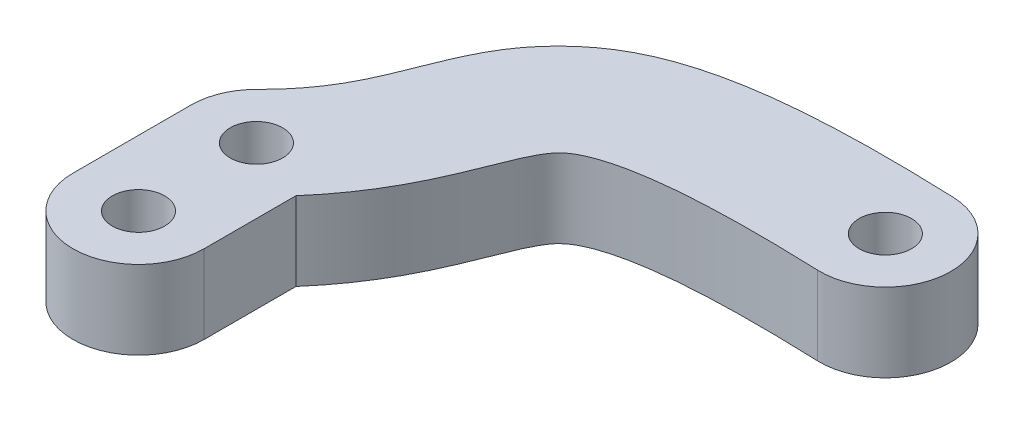
ISO-10303-21;
HEADER;
FILE_DESCRIPTION(('STEP AP214'),'2;1');
FILE_NAME('part.step','',(''),(''),'','','');
FILE_SCHEMA(('AUTOMOTIVE_DESIGN { 1 0 10303 214 1 1 1 1 }'));
ENDSEC;
DATA;
#1=APPLICATION_CONTEXT('core data for automotive mechanical design processes');
#2=APPLICATION_PROTOCOL_DEFINITION('international standard','automotive_design',2000,#1);
#3=PRODUCT_CONTEXT('',#1,'mechanical');
#4=PRODUCT('Part','Part','',(#3));
#5=PRODUCT_RELATED_PRODUCT_CATEGORY('part','',(#4));
#6=PRODUCT_DEFINITION_FORMATION('','',#4);
#7=PRODUCT_DEFINITION_CONTEXT('part definition',#1,'design');
#8=PRODUCT_DEFINITION('design','',#6,#7);
#9=PRODUCT_DEFINITION_SHAPE('','',#8);
#10=(LENGTH_UNIT() NAMED_UNIT(*) SI_UNIT(.MILLI.,.METRE.));
#11=(NAMED_UNIT(*) PLANE_ANGLE_UNIT() SI_UNIT($,.RADIAN.));
#12=(NAMED_UNIT(*) SI_UNIT($,.STERADIAN.) SOLID_ANGLE_UNIT());
#13=UNCERTAINTY_MEASURE_WITH_UNIT(LENGTH_MEASURE(1.E-05),#10,'distance_accuracy_value','');
#14=(GEOMETRIC_REPRESENTATION_CONTEXT(3) GLOBAL_UNCERTAINTY_ASSIGNED_CONTEXT((#13)) GLOBAL_UNIT_ASSIGNED_CONTEXT((#10,
#11,#12)) REPRESENTATION_CONTEXT('',''));
#15=CARTESIAN_POINT('',(0.,0.,0.));
#16=DIRECTION('',(0.,0.,1.));
#17=DIRECTION('',(1.,0.,0.));
#18=AXIS2_PLACEMENT_3D('',#15,#16,#17);
#19=CARTESIAN_POINT('',(2.49999999999998,3.,0.));
#20=DIRECTION('',(1.,0.,0.));
#21=DIRECTION('',(0.,0.,-1.));
#22=AXIS2_PLACEMENT_3D('',#19,#20,#21);
#23=PLANE('',#22);
#24=DIRECTION('',(0.,0.,1.));
#25=VECTOR('',#24,1.);
#26=CARTESIAN_POINT('',(2.49999999999998,0.,0.));
#27=LINE('',#26,#25);
#28=CARTESIAN_POINT('',(2.49999999999998,0.,0.990564635199866));
#29=VERTEX_POINT('',#28);
#30=CARTESIAN_POINT('',(2.49999999999998,0.,4.50000000001092));
#31=VERTEX_POINT('',#30);
#32=EDGE_CURVE('E126',#29,#31,#27,.T.);
#33=ORIENTED_EDGE('',*,*,#32,.F.);
#34=DIRECTION('',(0.,-1.,0.));
#35=VECTOR('',#34,1.);
#36=CARTESIAN_POINT('',(2.49999999999998,3.,0.990564635199866));
#37=LINE('',#36,#35);
#38=CARTESIAN_POINT('',(2.49999999999998,3.,0.990564635199866));
#39=VERTEX_POINT('',#38);
#40=EDGE_CURVE('E11',#39,#29,#37,.T.);
#41=ORIENTED_EDGE('',*,*,#40,.F.);
#42=DIRECTION('',(0.,0.,1.));
#43=VECTOR('',#42,1.);
#44=CARTESIAN_POINT('',(2.49999999999998,3.,0.));
#45=LINE('',#44,#43);
#46=CARTESIAN_POINT('',(2.49999999999998,3.,4.50000000001092));
#47=VERTEX_POINT('',#46);
#48=EDGE_CURVE('E152',#39,#47,#45,.T.);
#49=ORIENTED_EDGE('',*,*,#48,.T.);
#50=DIRECTION('',(0.,-1.,0.));
#51=VECTOR('',#50,1.);
#52=CARTESIAN_POINT('',(2.49999999999998,3.,4.50000000001092));
#53=LINE('',#52,#51);
#54=EDGE_CURVE('E82',#47,#31,#53,.T.);
#55=ORIENTED_EDGE('',*,*,#54,.T.);
#56=EDGE_LOOP('',(#33,#41,#49,#55));
#57=FACE_BOUND('',#56,.T.);
#58=ADVANCED_FACE('F35',(#57),#23,.T.);
#59=CARTESIAN_POINT('',(1.75437082003742,3.,1.78106233070079));
#60=CARTESIAN_POINT('',(1.95149697210396,3.,1.58689036765793));
#61=CARTESIAN_POINT('',(2.34214368552613,3.,1.17975493346549));
#62=CARTESIAN_POINT('',(3.02033012111773,3.,0.385545775477377));
#63=CARTESIAN_POINT('',(3.72584529825311,3.,-0.6037277778547));
#64=CARTESIAN_POINT('',(4.36365622671657,3.,-1.73546004815424));
#65=CARTESIAN_POINT('',(4.99488690874278,3.,-3.11694734572652));
#66=CARTESIAN_POINT('',(5.50437980804916,3.,-4.50358921540157));
#67=CARTESIAN_POINT('',(5.87870633113535,3.,-5.19924676306786));
#68=CARTESIAN_POINT('',(6.12578199890893,3.,-5.47591867299158));
#69=CARTESIAN_POINT('',(6.37281531651706,3.,-5.67228855252102));
#70=CARTESIAN_POINT('',(6.83021818781127,3.,-5.90833569401329));
#71=CARTESIAN_POINT('',(7.61172062144308,3.,-6.15667184241379));
#72=CARTESIAN_POINT('',(8.7718442575446,3.,-6.36967163441529));
#73=CARTESIAN_POINT('',(10.0802761969472,3.,-6.48954545598394));
#74=CARTESIAN_POINT('',(11.3439322689507,3.,-6.5407932360101));
#75=CARTESIAN_POINT('',(12.4087429419989,3.,-6.55507002084049));
#76=CARTESIAN_POINT('',(13.5750385876405,3.,-6.54446796380826));
#77=CARTESIAN_POINT('',(14.4721156957377,3.,-6.51817652956653));
#78=CARTESIAN_POINT('',(14.9055218828852,3.,-6.50178586078246));
#79=B_SPLINE_CURVE_WITH_KNOTS('',3,(#59,#60,#61,#62,#63,#64,#65,#66,#67,#68,#69,#70,#71,#72,#73,
#74,#75,#76,#77,#78),.UNSPECIFIED.,.F.,.F.,(4,1,1,1,1,1,1,1,1,1,1,1,1,1,1,1,1,4),(0.,0.03125,
0.0625,0.125,0.1875,0.25,0.375,0.5,0.5625,0.625,0.6875,0.75,0.8125,0.875,0.90625,0.9375,0.96875,
1.),.UNSPECIFIED.);
#80=DIRECTION('',(0.,-1.,0.));
#81=VECTOR('',#80,1.);
#82=SURFACE_OF_LINEAR_EXTRUSION('',#79,#81);
#83=CARTESIAN_POINT('',(1.75437082003742,0.,1.78106233070079));
#84=CARTESIAN_POINT('',(1.95149697210396,0.,1.58689036765793));
#85=CARTESIAN_POINT('',(2.34214368552613,0.,1.17975493346549));
#86=CARTESIAN_POINT('',(3.02033012111773,0.,0.385545775477377));
#87=CARTESIAN_POINT('',(3.72584529825311,0.,-0.6037277778547));
#88=CARTESIAN_POINT('',(4.36365622671657,0.,-1.73546004815424));
#89=CARTESIAN_POINT('',(4.99488690874278,0.,-3.11694734572652));
#90=CARTESIAN_POINT('',(5.50437980804916,0.,-4.50358921540157));
#91=CARTESIAN_POINT('',(5.87870633113535,0.,-5.19924676306786));
#92=CARTESIAN_POINT('',(6.12578199890893,0.,-5.47591867299158));
#93=CARTESIAN_POINT('',(6.37281531651706,0.,-5.67228855252102));
#94=CARTESIAN_POINT('',(6.83021818781127,0.,-5.90833569401329));
#95=CARTESIAN_POINT('',(7.61172062144308,0.,-6.15667184241379));
#96=CARTESIAN_POINT('',(8.7718442575446,0.,-6.36967163441529));
#97=CARTESIAN_POINT('',(10.0802761969472,0.,-6.48954545598394));
#98=CARTESIAN_POINT('',(11.3439322689507,0.,-6.5407932360101));
#99=CARTESIAN_POINT('',(12.4087429419989,0.,-6.55507002084049));
#100=CARTESIAN_POINT('',(13.5750385876405,0.,-6.54446796380826));
#101=CARTESIAN_POINT('',(14.4721156957377,0.,-6.51817652956653));
#102=CARTESIAN_POINT('',(14.9055218828852,0.,-6.50178586078246));
#103=B_SPLINE_CURVE_WITH_KNOTS('',3,(#83,#84,#85,#86,#87,#88,#89,#90,#91,#92,#93,#94,#95,#96,
#97,#98,#99,#100,#101,#102),.UNSPECIFIED.,.F.,.F.,(4,1,1,1,1,1,1,1,1,1,1,1,1,1,1,1,1,4),(0.,
0.03125,0.0625,0.125,0.1875,0.25,0.375,0.5,0.5625,0.625,0.6875,0.75,0.8125,0.875,0.90625,0.9375,
0.96875,1.),.UNSPECIFIED.);
#104=CARTESIAN_POINT('',(14.9055218828852,0.,-6.50178586078246));
#105=VERTEX_POINT('',#104);
#106=EDGE_CURVE('E129',#29,#105,#103,.T.);
#107=ORIENTED_EDGE('',*,*,#106,.T.);
#108=DIRECTION('',(0.,-1.,0.));
#109=VECTOR('',#108,1.);
#110=CARTESIAN_POINT('',(14.9055218828852,3.,-6.50178586078246));
#111=LINE('',#110,#109);
#112=CARTESIAN_POINT('',(14.9055218828852,3.,-6.50178586078246));
#113=VERTEX_POINT('',#112);
#114=EDGE_CURVE('E43',#113,#105,#111,.T.);
#115=ORIENTED_EDGE('',*,*,#114,.F.);
#116=EDGE_CURVE('E187',#39,#113,#79,.T.);
#117=ORIENTED_EDGE('',*,*,#116,.F.);
#118=ORIENTED_EDGE('',*,*,#40,.T.);
#119=EDGE_LOOP('',(#107,#115,#117,#118));
#120=FACE_BOUND('',#119,.T.);
#121=ADVANCED_FACE('F178',(#120),#82,.F.);
#122=CARTESIAN_POINT('',(15.,3.,-9.));
#123=DIRECTION('',(0.,-1.,0.));
#124=DIRECTION('',(0.,0.,-1.));
#125=AXIS2_PLACEMENT_3D('',#122,#123,#124);
#126=CYLINDRICAL_SURFACE('',#125,2.5);
#127=CARTESIAN_POINT('',(15.,0.,-9.));
#128=DIRECTION('',(0.,1.,0.));
#129=DIRECTION('',(0.,0.,1.));
#130=AXIS2_PLACEMENT_3D('',#127,#128,#129);
#131=CIRCLE('',#130,2.5);
#132=CARTESIAN_POINT('',(15.0944781171148,0.,-11.4982141392175));
#133=VERTEX_POINT('',#132);
#134=EDGE_CURVE('E134',#105,#133,#131,.T.);
#135=ORIENTED_EDGE('',*,*,#134,.T.);
#136=DIRECTION('',(0.,-1.,0.));
#137=VECTOR('',#136,1.);
#138=CARTESIAN_POINT('',(15.0944781171148,3.,-11.4982141392175));
#139=LINE('',#138,#137);
#140=CARTESIAN_POINT('',(15.0944781171148,3.,-11.4982141392175));
#141=VERTEX_POINT('',#140);
#142=EDGE_CURVE('E156',#141,#133,#139,.T.);
#143=ORIENTED_EDGE('',*,*,#142,.F.);
#144=CARTESIAN_POINT('',(15.,3.,-9.));
#145=DIRECTION('',(0.,1.,0.));
#146=DIRECTION('',(0.,0.,1.));
#147=AXIS2_PLACEMENT_3D('',#144,#145,#146);
#148=CIRCLE('',#147,2.5);
#149=EDGE_CURVE('E118',#113,#141,#148,.T.);
#150=ORIENTED_EDGE('',*,*,#149,.F.);
#151=ORIENTED_EDGE('',*,*,#114,.T.);
#152=EDGE_LOOP('',(#135,#143,#150,#151));
#153=FACE_BOUND('',#152,.T.);
#154=ADVANCED_FACE('F162',(#153),#126,.T.);
#155=CARTESIAN_POINT('',(-1.75437082003673,3.,-1.78106233067896));
#156=CARTESIAN_POINT('',(-1.62434407800666,3.,-1.90914045467908));
#157=CARTESIAN_POINT('',(-1.36361878328357,3.,-2.18092003124505));
#158=CARTESIAN_POINT('',(-0.934031434355,3.,-2.68489406574328));
#159=CARTESIAN_POINT('',(-0.500467653719624,3.,-3.29317450512142));
#160=CARTESIAN_POINT('',(-0.101558496897415,3.,-3.99905783835397));
#161=CARTESIAN_POINT('',(0.340804869789544,3.,-4.95789583236898));
#162=CARTESIAN_POINT('',(0.82191713671364,3.,-6.25557147662169));
#163=CARTESIAN_POINT('',(1.71434314807278,3.,-8.18812834675948));
#164=CARTESIAN_POINT('',(3.65588176160535,3.,-10.0809151030667));
#165=CARTESIAN_POINT('',(5.93337752406575,3.,-10.9408617877631));
#166=CARTESIAN_POINT('',(8.14654197146832,3.,-11.3365216763059));
#167=CARTESIAN_POINT('',(10.0800844724006,3.,-11.5099876405795));
#168=CARTESIAN_POINT('',(11.9785839238242,3.,-11.5594651580237));
#169=CARTESIAN_POINT('',(13.6772078670229,3.,-11.5437192593964));
#170=CARTESIAN_POINT('',(14.6308871008615,3.,-11.5157463457804));
#171=CARTESIAN_POINT('',(15.0944781171148,3.,-11.4982141392175));
#172=B_SPLINE_CURVE_WITH_KNOTS('',3,(#155,#156,#157,#158,#159,#160,#161,#162,#163,#164,#165,
#166,#167,#168,#169,#170,#171),.UNSPECIFIED.,.F.,.F.,(4,1,1,1,1,1,1,1,1,1,1,1,1,1,4),(0.,
0.03125,0.0625,0.125,0.1875,0.25,0.375,0.5,0.625,0.75,0.8125,0.875,0.9375,0.96875,1.),.UNSPECIFIED.);
#173=DIRECTION('',(0.,-1.,0.));
#174=VECTOR('',#173,1.);
#175=SURFACE_OF_LINEAR_EXTRUSION('',#172,#174);
#176=CARTESIAN_POINT('',(-1.75437082003673,0.,-1.78106233067896));
#177=CARTESIAN_POINT('',(-1.62434407800666,0.,-1.90914045467908));
#178=CARTESIAN_POINT('',(-1.36361878328357,0.,-2.18092003124505));
#179=CARTESIAN_POINT('',(-0.934031434355,0.,-2.68489406574328));
#180=CARTESIAN_POINT('',(-0.500467653719624,0.,-3.29317450512142));
#181=CARTESIAN_POINT('',(-0.101558496897415,0.,-3.99905783835397));
#182=CARTESIAN_POINT('',(0.340804869789544,0.,-4.95789583236898));
#183=CARTESIAN_POINT('',(0.82191713671364,0.,-6.25557147662169));
#184=CARTESIAN_POINT('',(1.71434314807278,0.,-8.18812834675948));
#185=CARTESIAN_POINT('',(3.65588176160535,0.,-10.0809151030667));
#186=CARTESIAN_POINT('',(5.93337752406575,0.,-10.9408617877631));
#187=CARTESIAN_POINT('',(8.14654197146832,0.,-11.3365216763059));
#188=CARTESIAN_POINT('',(10.0800844724006,0.,-11.5099876405795));
#189=CARTESIAN_POINT('',(11.9785839238242,0.,-11.5594651580237));
#190=CARTESIAN_POINT('',(13.6772078670229,0.,-11.5437192593964));
#191=CARTESIAN_POINT('',(14.6308871008615,0.,-11.5157463457804));
#192=CARTESIAN_POINT('',(15.0944781171148,0.,-11.4982141392175));
#193=B_SPLINE_CURVE_WITH_KNOTS('',3,(#176,#177,#178,#179,#180,#181,#182,#183,#184,#185,#186,
#187,#188,#189,#190,#191,#192),.UNSPECIFIED.,.F.,.F.,(4,1,1,1,1,1,1,1,1,1,1,1,1,1,4),(0.,
0.03125,0.0625,0.125,0.1875,0.25,0.375,0.5,0.625,0.75,0.8125,0.875,0.9375,0.96875,1.),.UNSPECIFIED.);
#194=CARTESIAN_POINT('',(-1.75437082003673,0.,-1.78106233067896));
#195=VERTEX_POINT('',#194);
#196=EDGE_CURVE('E140',#195,#133,#193,.T.);
#197=ORIENTED_EDGE('',*,*,#196,.F.);
#198=DIRECTION('',(0.,-1.,0.));
#199=VECTOR('',#198,1.);
#200=CARTESIAN_POINT('',(-1.75437082003673,3.,-1.78106233067896));
#201=LINE('',#200,#199);
#202=CARTESIAN_POINT('',(-1.75437082003673,3.,-1.78106233067896));
#203=VERTEX_POINT('',#202);
#204=EDGE_CURVE('E107',#203,#195,#201,.T.);
#205=ORIENTED_EDGE('',*,*,#204,.F.);
#206=EDGE_CURVE('E116',#203,#141,#172,.T.);
#207=ORIENTED_EDGE('',*,*,#206,.T.);
#208=ORIENTED_EDGE('',*,*,#142,.T.);
#209=EDGE_LOOP('',(#197,#205,#207,#208));
#210=FACE_BOUND('',#209,.T.);
#211=ADVANCED_FACE('F170',(#210),#175,.T.);
#212=CARTESIAN_POINT('',(3.43475248243408E-13,3.,1.0916614834322E-11));
#213=DIRECTION('',(0.,-1.,0.));
#214=DIRECTION('',(0.,0.,-1.));
#215=AXIS2_PLACEMENT_3D('',#212,#213,#214);
#216=CYLINDRICAL_SURFACE('',#215,2.5);
#217=CARTESIAN_POINT('',(3.43475248243408E-13,0.,1.0916614834322E-11));
#218=DIRECTION('',(0.,1.,0.));
#219=DIRECTION('',(0.,0.,1.));
#220=AXIS2_PLACEMENT_3D('',#217,#218,#219);
#221=CIRCLE('',#220,2.5);
#222=CARTESIAN_POINT('',(-2.49999999999982,0.,1.09169209955573E-11));
#223=VERTEX_POINT('',#222);
#224=EDGE_CURVE('E106',#223,#195,#221,.F.);
#225=ORIENTED_EDGE('',*,*,#224,.F.);
#226=DIRECTION('',(0.,-1.,0.));
#227=VECTOR('',#226,1.);
#228=CARTESIAN_POINT('',(-2.49999999999982,3.,1.09169209955573E-11));
#229=LINE('',#228,#227);
#230=CARTESIAN_POINT('',(-2.49999999999982,3.,1.09169209955573E-11));
#231=VERTEX_POINT('',#230);
#232=EDGE_CURVE('E100',#231,#223,#229,.T.);
#233=ORIENTED_EDGE('',*,*,#232,.F.);
#234=CARTESIAN_POINT('',(3.43475248243408E-13,3.,1.0916614834322E-11));
#235=DIRECTION('',(0.,1.,0.));
#236=DIRECTION('',(0.,0.,1.));
#237=AXIS2_PLACEMENT_3D('',#234,#235,#236);
#238=CIRCLE('',#237,2.5);
#239=EDGE_CURVE('E104',#231,#203,#238,.F.);
#240=ORIENTED_EDGE('',*,*,#239,.T.);
#241=ORIENTED_EDGE('',*,*,#204,.T.);
#242=EDGE_LOOP('',(#225,#233,#240,#241));
#243=FACE_BOUND('',#242,.T.);
#244=ADVANCED_FACE('F102',(#243),#216,.T.);
#245=CARTESIAN_POINT('',(-2.49999999999998,3.,0.));
#246=DIRECTION('',(1.,0.,0.));
#247=DIRECTION('',(0.,0.,-1.));
#248=AXIS2_PLACEMENT_3D('',#245,#246,#247);
#249=PLANE('',#248);
#250=DIRECTION('',(0.,0.,1.));
#251=VECTOR('',#250,1.);
#252=CARTESIAN_POINT('',(-2.49999999999998,0.,0.));
#253=LINE('',#252,#251);
#254=CARTESIAN_POINT('',(-2.49999999999998,0.,4.50000000001092));
#255=VERTEX_POINT('',#254);
#256=EDGE_CURVE('E75',#223,#255,#253,.T.);
#257=ORIENTED_EDGE('',*,*,#256,.T.);
#258=DIRECTION('',(0.,-1.,0.));
#259=VECTOR('',#258,1.);
#260=CARTESIAN_POINT('',(-2.49999999999998,3.,4.50000000001092));
#261=LINE('',#260,#259);
#262=CARTESIAN_POINT('',(-2.49999999999998,3.,4.50000000001092));
#263=VERTEX_POINT('',#262);
#264=EDGE_CURVE('E108',#263,#255,#261,.T.);
#265=ORIENTED_EDGE('',*,*,#264,.F.);
#266=DIRECTION('',(0.,0.,1.));
#267=VECTOR('',#266,1.);
#268=CARTESIAN_POINT('',(-2.49999999999998,3.,0.));
#269=LINE('',#268,#267);
#270=EDGE_CURVE('E110',#231,#263,#269,.T.);
#271=ORIENTED_EDGE('',*,*,#270,.F.);
#272=ORIENTED_EDGE('',*,*,#232,.T.);
#273=EDGE_LOOP('',(#257,#265,#271,#272));
#274=FACE_BOUND('',#273,.T.);
#275=ADVANCED_FACE('F111',(#274),#249,.F.);
#276=CARTESIAN_POINT('',(0.,3.,4.50000000001092));
#277=DIRECTION('',(0.,-1.,0.));
#278=DIRECTION('',(0.,0.,-1.));
#279=AXIS2_PLACEMENT_3D('',#276,#277,#278);
#280=CYLINDRICAL_SURFACE('',#279,2.49999999999998);
#281=CARTESIAN_POINT('',(0.,0.,4.50000000001092));
#282=DIRECTION('',(0.,1.,0.));
#283=DIRECTION('',(0.,0.,1.));
#284=AXIS2_PLACEMENT_3D('',#281,#282,#283);
#285=CIRCLE('',#284,2.49999999999998);
#286=EDGE_CURVE('E150',#255,#31,#285,.T.);
#287=ORIENTED_EDGE('',*,*,#286,.T.);
#288=ORIENTED_EDGE('',*,*,#54,.F.);
#289=CARTESIAN_POINT('',(0.,3.,4.50000000001092));
#290=DIRECTION('',(0.,1.,0.));
#291=DIRECTION('',(0.,0.,1.));
#292=AXIS2_PLACEMENT_3D('',#289,#290,#291);
#293=CIRCLE('',#292,2.49999999999998);
#294=EDGE_CURVE('E51',#263,#47,#293,.T.);
#295=ORIENTED_EDGE('',*,*,#294,.F.);
#296=ORIENTED_EDGE('',*,*,#264,.T.);
#297=EDGE_LOOP('',(#287,#288,#295,#296));
#298=FACE_BOUND('',#297,.T.);
#299=ADVANCED_FACE('F186',(#298),#280,.T.);
#300=CARTESIAN_POINT('',(0.,3.,0.));
#301=DIRECTION('',(0.,1.,0.));
#302=DIRECTION('',(0.,0.,1.));
#303=AXIS2_PLACEMENT_3D('',#300,#301,#302);
#304=PLANE('',#303);
#305=CARTESIAN_POINT('',(0.,3.,4.50000000001092));
#306=DIRECTION('',(0.,1.,0.));
#307=DIRECTION('',(0.,0.,1.));
#308=AXIS2_PLACEMENT_3D('',#305,#306,#307);
#309=CIRCLE('',#308,1.00000000000313);
#310=CARTESIAN_POINT('',(0.,3.,5.50000000001405));
#311=VERTEX_POINT('',#310);
#312=EDGE_CURVE('E209',#311,#311,#309,.T.);
#313=ORIENTED_EDGE('',*,*,#312,.F.);
#314=EDGE_LOOP('',(#313));
#315=FACE_BOUND('',#314,.T.);
#316=CARTESIAN_POINT('',(15.,3.,-9.));
#317=DIRECTION('',(0.,1.,0.));
#318=DIRECTION('',(0.,0.,1.));
#319=AXIS2_PLACEMENT_3D('',#316,#317,#318);
#320=CIRCLE('',#319,0.999999999999999);
#321=CARTESIAN_POINT('',(15.,3.,-8.));
#322=VERTEX_POINT('',#321);
#323=EDGE_CURVE('E203',#322,#322,#320,.T.);
#324=ORIENTED_EDGE('',*,*,#323,.F.);
#325=EDGE_LOOP('',(#324));
#326=FACE_BOUND('',#325,.T.);
#327=CARTESIAN_POINT('',(0.,3.,0.));
#328=DIRECTION('',(0.,1.,0.));
#329=DIRECTION('',(0.,0.,1.));
#330=AXIS2_PLACEMENT_3D('',#327,#328,#329);
#331=CIRCLE('',#330,1.);
#332=CARTESIAN_POINT('',(0.,3.,1.));
#333=VERTEX_POINT('',#332);
#334=EDGE_CURVE('E191',#333,#333,#331,.T.);
#335=ORIENTED_EDGE('',*,*,#334,.F.);
#336=EDGE_LOOP('',(#335));
#337=FACE_BOUND('',#336,.T.);
#338=ORIENTED_EDGE('',*,*,#48,.F.);
#339=ORIENTED_EDGE('',*,*,#116,.T.);
#340=ORIENTED_EDGE('',*,*,#149,.T.);
#341=ORIENTED_EDGE('',*,*,#206,.F.);
#342=ORIENTED_EDGE('',*,*,#239,.F.);
#343=ORIENTED_EDGE('',*,*,#270,.T.);
#344=ORIENTED_EDGE('',*,*,#294,.T.);
#345=EDGE_LOOP('',(#338,#339,#340,#341,#342,#343,#344));
#346=FACE_BOUND('',#345,.T.);
#347=ADVANCED_FACE('F114',(#315,#326,#337,#346),#304,.T.);
#348=CARTESIAN_POINT('',(0.,0.,0.));
#349=DIRECTION('',(0.,1.,0.));
#350=DIRECTION('',(0.,0.,1.));
#351=AXIS2_PLACEMENT_3D('',#348,#349,#350);
#352=PLANE('',#351);
#353=CARTESIAN_POINT('',(0.,0.,4.50000000001092));
#354=DIRECTION('',(0.,1.,0.));
#355=DIRECTION('',(0.,0.,1.));
#356=AXIS2_PLACEMENT_3D('',#353,#354,#355);
#357=CIRCLE('',#356,1.00000000000313);
#358=CARTESIAN_POINT('',(0.,0.,5.50000000001405));
#359=VERTEX_POINT('',#358);
#360=EDGE_CURVE('E200',#359,#359,#357,.T.);
#361=ORIENTED_EDGE('',*,*,#360,.T.);
#362=EDGE_LOOP('',(#361));
#363=FACE_BOUND('',#362,.T.);
#364=CARTESIAN_POINT('',(15.,0.,-9.));
#365=DIRECTION('',(0.,1.,0.));
#366=DIRECTION('',(0.,0.,1.));
#367=AXIS2_PLACEMENT_3D('',#364,#365,#366);
#368=CIRCLE('',#367,0.999999999999999);
#369=CARTESIAN_POINT('',(15.,0.,-8.));
#370=VERTEX_POINT('',#369);
#371=EDGE_CURVE('E206',#370,#370,#368,.T.);
#372=ORIENTED_EDGE('',*,*,#371,.T.);
#373=EDGE_LOOP('',(#372));
#374=FACE_BOUND('',#373,.T.);
#375=CARTESIAN_POINT('',(0.,0.,0.));
#376=DIRECTION('',(0.,1.,0.));
#377=DIRECTION('',(0.,0.,1.));
#378=AXIS2_PLACEMENT_3D('',#375,#376,#377);
#379=CIRCLE('',#378,1.);
#380=CARTESIAN_POINT('',(0.,0.,1.));
#381=VERTEX_POINT('',#380);
#382=EDGE_CURVE('E130',#381,#381,#379,.T.);
#383=ORIENTED_EDGE('',*,*,#382,.T.);
#384=EDGE_LOOP('',(#383));
#385=FACE_BOUND('',#384,.T.);
#386=ORIENTED_EDGE('',*,*,#32,.T.);
#387=ORIENTED_EDGE('',*,*,#286,.F.);
#388=ORIENTED_EDGE('',*,*,#256,.F.);
#389=ORIENTED_EDGE('',*,*,#224,.T.);
#390=ORIENTED_EDGE('',*,*,#196,.T.);
#391=ORIENTED_EDGE('',*,*,#134,.F.);
#392=ORIENTED_EDGE('',*,*,#106,.F.);
#393=EDGE_LOOP('',(#386,#387,#388,#389,#390,#391,#392));
#394=FACE_BOUND('',#393,.T.);
#395=ADVANCED_FACE('F167',(#363,#374,#385,#394),#352,.F.);
#396=CARTESIAN_POINT('',(0.,0.,0.));
#397=DIRECTION('',(0.,1.,0.));
#398=DIRECTION('',(0.,0.,1.));
#399=AXIS2_PLACEMENT_3D('',#396,#397,#398);
#400=CYLINDRICAL_SURFACE('',#399,1.);
#401=ORIENTED_EDGE('',*,*,#382,.F.);
#402=EDGE_LOOP('',(#401));
#403=FACE_BOUND('',#402,.T.);
#404=ORIENTED_EDGE('',*,*,#334,.T.);
#405=EDGE_LOOP('',(#404));
#406=FACE_BOUND('',#405,.T.);
#407=ADVANCED_FACE('F231',(#403,#406),#400,.F.);
#408=CARTESIAN_POINT('',(15.,0.,-9.));
#409=DIRECTION('',(0.,1.,0.));
#410=DIRECTION('',(0.,0.,1.));
#411=AXIS2_PLACEMENT_3D('',#408,#409,#410);
#412=CYLINDRICAL_SURFACE('',#411,0.999999999999999);
#413=ORIENTED_EDGE('',*,*,#371,.F.);
#414=EDGE_LOOP('',(#413));
#415=FACE_BOUND('',#414,.T.);
#416=ORIENTED_EDGE('',*,*,#323,.T.);
#417=EDGE_LOOP('',(#416));
#418=FACE_BOUND('',#417,.T.);
#419=ADVANCED_FACE('F220',(#415,#418),#412,.F.);
#420=CARTESIAN_POINT('',(0.,0.,4.50000000001092));
#421=DIRECTION('',(0.,1.,0.));
#422=DIRECTION('',(0.,0.,1.));
#423=AXIS2_PLACEMENT_3D('',#420,#421,#422);
#424=CYLINDRICAL_SURFACE('',#423,1.00000000000313);
#425=ORIENTED_EDGE('',*,*,#360,.F.);
#426=EDGE_LOOP('',(#425));
#427=FACE_BOUND('',#426,.T.);
#428=ORIENTED_EDGE('',*,*,#312,.T.);
#429=EDGE_LOOP('',(#428));
#430=FACE_BOUND('',#429,.T.);
#431=ADVANCED_FACE('F217',(#427,#430),#424,.F.);
#432=CLOSED_SHELL('',(#58,#121,#154,#211,#244,#275,#299,#347,#395,#407,#419,#431));
#433=MANIFOLD_SOLID_BREP('B2',#432);
#434=ADVANCED_BREP_SHAPE_REPRESENTATION('',(#18,#433),#14);
#435=SHAPE_DEFINITION_REPRESENTATION(#9,#434);
ENDSEC;
END-ISO-10303-21;
